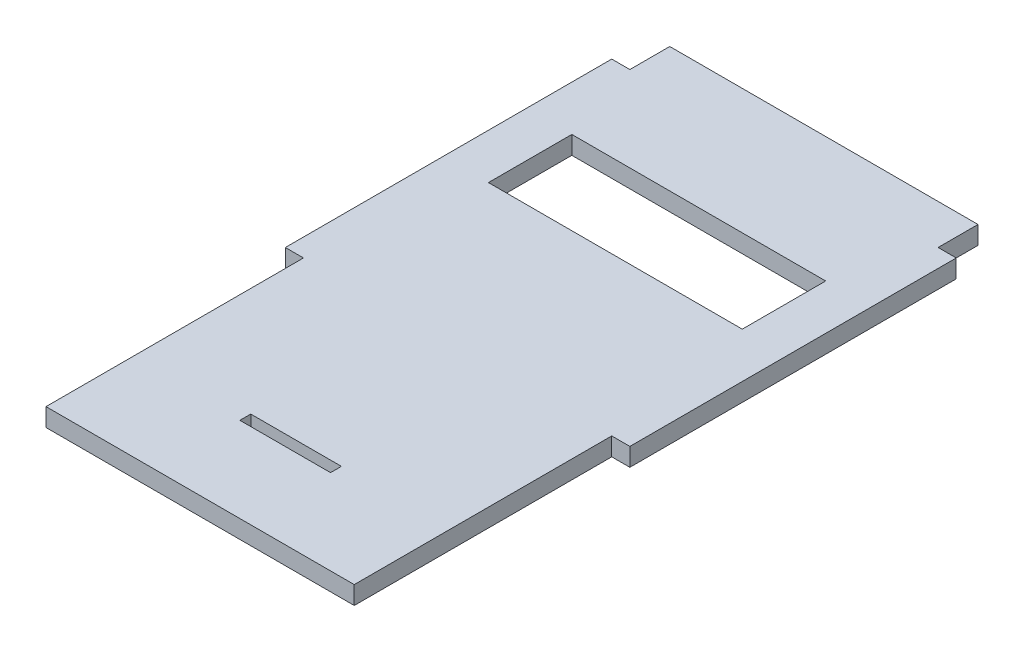
ISO-10303-21;
HEADER;
FILE_DESCRIPTION(('STEP AP214'),'2;1');
FILE_NAME('part.step','',(''),(''),'','','');
FILE_SCHEMA(('AUTOMOTIVE_DESIGN { 1 0 10303 214 1 1 1 1 }'));
ENDSEC;
DATA;
#1=APPLICATION_CONTEXT('core data for automotive mechanical design processes');
#2=APPLICATION_PROTOCOL_DEFINITION('international standard','automotive_design',2000,#1);
#3=PRODUCT_CONTEXT('',#1,'mechanical');
#4=PRODUCT('Part','Part','',(#3));
#5=PRODUCT_RELATED_PRODUCT_CATEGORY('part','',(#4));
#6=PRODUCT_DEFINITION_FORMATION('','',#4);
#7=PRODUCT_DEFINITION_CONTEXT('part definition',#1,'design');
#8=PRODUCT_DEFINITION('design','',#6,#7);
#9=PRODUCT_DEFINITION_SHAPE('','',#8);
#10=(LENGTH_UNIT() NAMED_UNIT(*) SI_UNIT(.MILLI.,.METRE.));
#11=(NAMED_UNIT(*) PLANE_ANGLE_UNIT() SI_UNIT($,.RADIAN.));
#12=(NAMED_UNIT(*) SI_UNIT($,.STERADIAN.) SOLID_ANGLE_UNIT());
#13=UNCERTAINTY_MEASURE_WITH_UNIT(LENGTH_MEASURE(1.E-05),#10,'distance_accuracy_value','');
#14=(GEOMETRIC_REPRESENTATION_CONTEXT(3) GLOBAL_UNCERTAINTY_ASSIGNED_CONTEXT((#13)) GLOBAL_UNIT_ASSIGNED_CONTEXT((#10,
#11,#12)) REPRESENTATION_CONTEXT('',''));
#15=CARTESIAN_POINT('',(0.,0.,0.));
#16=DIRECTION('',(0.,0.,1.));
#17=DIRECTION('',(1.,0.,0.));
#18=AXIS2_PLACEMENT_3D('',#15,#16,#17);
#19=CARTESIAN_POINT('',(0.,5.,0.));
#20=DIRECTION('',(0.,-1.,0.));
#21=DIRECTION('',(0.,0.,-1.));
#22=AXIS2_PLACEMENT_3D('',#19,#20,#21);
#23=PLANE('',#22);
#24=DIRECTION('',(0.,0.,-1.));
#25=VECTOR('',#24,1.);
#26=CARTESIAN_POINT('',(12.5000000000001,5.,62.5396332629801));
#27=LINE('',#26,#25);
#28=CARTESIAN_POINT('',(12.5000000000001,5.,62.5396332629801));
#29=VERTEX_POINT('',#28);
#30=CARTESIAN_POINT('',(12.5000000000001,5.,59.5396332629801));
#31=VERTEX_POINT('',#30);
#32=EDGE_CURVE('E206',#29,#31,#27,.T.);
#33=ORIENTED_EDGE('',*,*,#32,.F.);
#34=DIRECTION('',(1.,0.,0.));
#35=VECTOR('',#34,1.);
#36=CARTESIAN_POINT('',(-12.4999999999999,5.,62.5396332629801));
#37=LINE('',#36,#35);
#38=CARTESIAN_POINT('',(-12.4999999999999,5.,62.5396332629801));
#39=VERTEX_POINT('',#38);
#40=EDGE_CURVE('E214',#39,#29,#37,.T.);
#41=ORIENTED_EDGE('',*,*,#40,.F.);
#42=DIRECTION('',(0.,0.,1.));
#43=VECTOR('',#42,1.);
#44=CARTESIAN_POINT('',(-12.4999999999999,5.,62.5396332629801));
#45=LINE('',#44,#43);
#46=CARTESIAN_POINT('',(-12.4999999999999,5.,59.5396332629801));
#47=VERTEX_POINT('',#46);
#48=EDGE_CURVE('E211',#47,#39,#45,.T.);
#49=ORIENTED_EDGE('',*,*,#48,.F.);
#50=DIRECTION('',(-1.,0.,0.));
#51=VECTOR('',#50,1.);
#52=CARTESIAN_POINT('',(-12.4999999999999,5.,59.5396332629801));
#53=LINE('',#52,#51);
#54=EDGE_CURVE('E208',#31,#47,#53,.T.);
#55=ORIENTED_EDGE('',*,*,#54,.F.);
#56=EDGE_LOOP('',(#33,#41,#49,#55));
#57=FACE_BOUND('',#56,.T.);
#58=DIRECTION('',(0.,0.,-1.));
#59=VECTOR('',#58,1.);
#60=CARTESIAN_POINT('',(42.5,5.,-75.));
#61=LINE('',#60,#59);
#62=CARTESIAN_POINT('',(42.5,5.,-75.));
#63=VERTEX_POINT('',#62);
#64=CARTESIAN_POINT('',(42.5,5.,-86.));
#65=VERTEX_POINT('',#64);
#66=EDGE_CURVE('E237',#63,#65,#61,.T.);
#67=ORIENTED_EDGE('',*,*,#66,.T.);
#68=DIRECTION('',(-1.,0.,0.));
#69=VECTOR('',#68,1.);
#70=CARTESIAN_POINT('',(-42.5,5.,-86.));
#71=LINE('',#70,#69);
#72=CARTESIAN_POINT('',(-42.5,5.,-86.));
#73=VERTEX_POINT('',#72);
#74=EDGE_CURVE('E240',#65,#73,#71,.T.);
#75=ORIENTED_EDGE('',*,*,#74,.T.);
#76=DIRECTION('',(0.,0.,1.));
#77=VECTOR('',#76,1.);
#78=CARTESIAN_POINT('',(-42.5,5.,-75.));
#79=LINE('',#78,#77);
#80=CARTESIAN_POINT('',(-42.5,5.,-75.));
#81=VERTEX_POINT('',#80);
#82=EDGE_CURVE('E243',#73,#81,#79,.T.);
#83=ORIENTED_EDGE('',*,*,#82,.T.);
#84=DIRECTION('',(-1.,0.,0.));
#85=VECTOR('',#84,1.);
#86=CARTESIAN_POINT('',(-42.5,5.,-75.));
#87=LINE('',#86,#85);
#88=CARTESIAN_POINT('',(-47.5,5.,-75.));
#89=VERTEX_POINT('',#88);
#90=EDGE_CURVE('E245',#81,#89,#87,.T.);
#91=ORIENTED_EDGE('',*,*,#90,.T.);
#92=DIRECTION('',(0.,0.,1.));
#93=VECTOR('',#92,1.);
#94=CARTESIAN_POINT('',(-47.5,5.,15.));
#95=LINE('',#94,#93);
#96=CARTESIAN_POINT('',(-47.5,5.,15.));
#97=VERTEX_POINT('',#96);
#98=EDGE_CURVE('E247',#89,#97,#95,.T.);
#99=ORIENTED_EDGE('',*,*,#98,.T.);
#100=DIRECTION('',(1.,0.,0.));
#101=VECTOR('',#100,1.);
#102=CARTESIAN_POINT('',(-42.5,5.,15.));
#103=LINE('',#102,#101);
#104=CARTESIAN_POINT('',(-42.5,5.,15.));
#105=VERTEX_POINT('',#104);
#106=EDGE_CURVE('E249',#97,#105,#103,.T.);
#107=ORIENTED_EDGE('',*,*,#106,.T.);
#108=DIRECTION('',(0.,0.,1.));
#109=VECTOR('',#108,1.);
#110=CARTESIAN_POINT('',(-42.5,5.,86.));
#111=LINE('',#110,#109);
#112=CARTESIAN_POINT('',(-42.5,5.,86.));
#113=VERTEX_POINT('',#112);
#114=EDGE_CURVE('E251',#105,#113,#111,.T.);
#115=ORIENTED_EDGE('',*,*,#114,.T.);
#116=DIRECTION('',(1.,0.,0.));
#117=VECTOR('',#116,1.);
#118=CARTESIAN_POINT('',(-42.5,5.,86.));
#119=LINE('',#118,#117);
#120=CARTESIAN_POINT('',(42.5,5.,86.));
#121=VERTEX_POINT('',#120);
#122=EDGE_CURVE('E253',#113,#121,#119,.T.);
#123=ORIENTED_EDGE('',*,*,#122,.T.);
#124=DIRECTION('',(0.,0.,-1.));
#125=VECTOR('',#124,1.);
#126=CARTESIAN_POINT('',(42.5,5.,86.));
#127=LINE('',#126,#125);
#128=CARTESIAN_POINT('',(42.5,5.,15.));
#129=VERTEX_POINT('',#128);
#130=EDGE_CURVE('E255',#121,#129,#127,.T.);
#131=ORIENTED_EDGE('',*,*,#130,.T.);
#132=DIRECTION('',(1.,0.,0.));
#133=VECTOR('',#132,1.);
#134=CARTESIAN_POINT('',(42.5,5.,15.));
#135=LINE('',#134,#133);
#136=CARTESIAN_POINT('',(47.5,5.,15.));
#137=VERTEX_POINT('',#136);
#138=EDGE_CURVE('E257',#129,#137,#135,.T.);
#139=ORIENTED_EDGE('',*,*,#138,.T.);
#140=DIRECTION('',(0.,0.,-1.));
#141=VECTOR('',#140,1.);
#142=CARTESIAN_POINT('',(47.5,5.,-75.));
#143=LINE('',#142,#141);
#144=CARTESIAN_POINT('',(47.5,5.,-75.));
#145=VERTEX_POINT('',#144);
#146=EDGE_CURVE('E259',#137,#145,#143,.T.);
#147=ORIENTED_EDGE('',*,*,#146,.T.);
#148=DIRECTION('',(-1.,0.,0.));
#149=VECTOR('',#148,1.);
#150=CARTESIAN_POINT('',(42.5,5.,-75.));
#151=LINE('',#150,#149);
#152=EDGE_CURVE('E261',#145,#63,#151,.T.);
#153=ORIENTED_EDGE('',*,*,#152,.T.);
#154=EDGE_LOOP('',(#67,#75,#83,#91,#99,#107,#115,#123,#131,#139,#147,#153));
#155=FACE_BOUND('',#154,.T.);
#156=DIRECTION('',(0.,0.,-1.));
#157=VECTOR('',#156,1.);
#158=CARTESIAN_POINT('',(35.,5.,-28.5));
#159=LINE('',#158,#157);
#160=CARTESIAN_POINT('',(35.,5.,-28.5));
#161=VERTEX_POINT('',#160);
#162=CARTESIAN_POINT('',(35.,5.,-51.5));
#163=VERTEX_POINT('',#162);
#164=EDGE_CURVE('E170',#161,#163,#159,.T.);
#165=ORIENTED_EDGE('',*,*,#164,.F.);
#166=DIRECTION('',(1.,0.,0.));
#167=VECTOR('',#166,1.);
#168=CARTESIAN_POINT('',(-35.,5.,-28.5));
#169=LINE('',#168,#167);
#170=CARTESIAN_POINT('',(-35.,5.,-28.5));
#171=VERTEX_POINT('',#170);
#172=EDGE_CURVE('E192',#171,#161,#169,.T.);
#173=ORIENTED_EDGE('',*,*,#172,.F.);
#174=DIRECTION('',(0.,0.,1.));
#175=VECTOR('',#174,1.);
#176=CARTESIAN_POINT('',(-35.,5.,-28.5));
#177=LINE('',#176,#175);
#178=CARTESIAN_POINT('',(-35.,5.,-51.5));
#179=VERTEX_POINT('',#178);
#180=EDGE_CURVE('E190',#179,#171,#177,.T.);
#181=ORIENTED_EDGE('',*,*,#180,.F.);
#182=DIRECTION('',(-1.,0.,0.));
#183=VECTOR('',#182,1.);
#184=CARTESIAN_POINT('',(-35.,5.,-51.5));
#185=LINE('',#184,#183);
#186=EDGE_CURVE('E178',#163,#179,#185,.T.);
#187=ORIENTED_EDGE('',*,*,#186,.F.);
#188=EDGE_LOOP('',(#165,#173,#181,#187));
#189=FACE_BOUND('',#188,.T.);
#190=ADVANCED_FACE('F33',(#57,#155,#189),#23,.F.);
#191=CARTESIAN_POINT('',(0.,0.,0.));
#192=DIRECTION('',(0.,-1.,0.));
#193=DIRECTION('',(0.,0.,-1.));
#194=AXIS2_PLACEMENT_3D('',#191,#192,#193);
#195=PLANE('',#194);
#196=DIRECTION('',(1.,0.,0.));
#197=VECTOR('',#196,1.);
#198=CARTESIAN_POINT('',(-12.4999999999999,0.,62.5396332629801));
#199=LINE('',#198,#197);
#200=CARTESIAN_POINT('',(-12.4999999999999,0.,62.5396332629801));
#201=VERTEX_POINT('',#200);
#202=CARTESIAN_POINT('',(12.5000000000001,0.,62.5396332629801));
#203=VERTEX_POINT('',#202);
#204=EDGE_CURVE('E209',#201,#203,#199,.T.);
#205=ORIENTED_EDGE('',*,*,#204,.T.);
#206=DIRECTION('',(0.,0.,-1.));
#207=VECTOR('',#206,1.);
#208=CARTESIAN_POINT('',(12.5000000000001,0.,62.5396332629801));
#209=LINE('',#208,#207);
#210=CARTESIAN_POINT('',(12.5000000000001,0.,59.5396332629801));
#211=VERTEX_POINT('',#210);
#212=EDGE_CURVE('E186',#203,#211,#209,.T.);
#213=ORIENTED_EDGE('',*,*,#212,.T.);
#214=DIRECTION('',(-1.,0.,0.));
#215=VECTOR('',#214,1.);
#216=CARTESIAN_POINT('',(-12.4999999999999,0.,59.5396332629801));
#217=LINE('',#216,#215);
#218=CARTESIAN_POINT('',(-12.4999999999999,0.,59.5396332629801));
#219=VERTEX_POINT('',#218);
#220=EDGE_CURVE('E219',#211,#219,#217,.T.);
#221=ORIENTED_EDGE('',*,*,#220,.T.);
#222=DIRECTION('',(0.,0.,1.));
#223=VECTOR('',#222,1.);
#224=CARTESIAN_POINT('',(-12.4999999999999,0.,62.5396332629801));
#225=LINE('',#224,#223);
#226=EDGE_CURVE('E222',#219,#201,#225,.T.);
#227=ORIENTED_EDGE('',*,*,#226,.T.);
#228=EDGE_LOOP('',(#205,#213,#221,#227));
#229=FACE_BOUND('',#228,.T.);
#230=DIRECTION('',(0.,0.,-1.));
#231=VECTOR('',#230,1.);
#232=CARTESIAN_POINT('',(42.5,0.,-75.));
#233=LINE('',#232,#231);
#234=CARTESIAN_POINT('',(42.5,0.,-75.));
#235=VERTEX_POINT('',#234);
#236=CARTESIAN_POINT('',(42.5,0.,-86.));
#237=VERTEX_POINT('',#236);
#238=EDGE_CURVE('E236',#235,#237,#233,.T.);
#239=ORIENTED_EDGE('',*,*,#238,.F.);
#240=DIRECTION('',(-1.,0.,0.));
#241=VECTOR('',#240,1.);
#242=CARTESIAN_POINT('',(42.5,0.,-75.));
#243=LINE('',#242,#241);
#244=CARTESIAN_POINT('',(47.5,0.,-75.));
#245=VERTEX_POINT('',#244);
#246=EDGE_CURVE('E241',#245,#235,#243,.T.);
#247=ORIENTED_EDGE('',*,*,#246,.F.);
#248=DIRECTION('',(0.,0.,-1.));
#249=VECTOR('',#248,1.);
#250=CARTESIAN_POINT('',(47.5,0.,-75.));
#251=LINE('',#250,#249);
#252=CARTESIAN_POINT('',(47.5,0.,15.));
#253=VERTEX_POINT('',#252);
#254=EDGE_CURVE('E284',#253,#245,#251,.T.);
#255=ORIENTED_EDGE('',*,*,#254,.F.);
#256=DIRECTION('',(1.,0.,0.));
#257=VECTOR('',#256,1.);
#258=CARTESIAN_POINT('',(42.5,0.,15.));
#259=LINE('',#258,#257);
#260=CARTESIAN_POINT('',(42.5,0.,15.));
#261=VERTEX_POINT('',#260);
#262=EDGE_CURVE('E282',#261,#253,#259,.T.);
#263=ORIENTED_EDGE('',*,*,#262,.F.);
#264=DIRECTION('',(0.,0.,-1.));
#265=VECTOR('',#264,1.);
#266=CARTESIAN_POINT('',(42.5,0.,86.));
#267=LINE('',#266,#265);
#268=CARTESIAN_POINT('',(42.5,0.,86.));
#269=VERTEX_POINT('',#268);
#270=EDGE_CURVE('E280',#269,#261,#267,.T.);
#271=ORIENTED_EDGE('',*,*,#270,.F.);
#272=DIRECTION('',(1.,0.,0.));
#273=VECTOR('',#272,1.);
#274=CARTESIAN_POINT('',(-42.5,0.,86.));
#275=LINE('',#274,#273);
#276=CARTESIAN_POINT('',(-42.5,0.,86.));
#277=VERTEX_POINT('',#276);
#278=EDGE_CURVE('E278',#277,#269,#275,.T.);
#279=ORIENTED_EDGE('',*,*,#278,.F.);
#280=DIRECTION('',(0.,0.,1.));
#281=VECTOR('',#280,1.);
#282=CARTESIAN_POINT('',(-42.5,0.,86.));
#283=LINE('',#282,#281);
#284=CARTESIAN_POINT('',(-42.5,0.,15.));
#285=VERTEX_POINT('',#284);
#286=EDGE_CURVE('E276',#285,#277,#283,.T.);
#287=ORIENTED_EDGE('',*,*,#286,.F.);
#288=DIRECTION('',(1.,0.,0.));
#289=VECTOR('',#288,1.);
#290=CARTESIAN_POINT('',(-42.5,0.,15.));
#291=LINE('',#290,#289);
#292=CARTESIAN_POINT('',(-47.5,0.,15.));
#293=VERTEX_POINT('',#292);
#294=EDGE_CURVE('E274',#293,#285,#291,.T.);
#295=ORIENTED_EDGE('',*,*,#294,.F.);
#296=DIRECTION('',(0.,0.,1.));
#297=VECTOR('',#296,1.);
#298=CARTESIAN_POINT('',(-47.5,0.,15.));
#299=LINE('',#298,#297);
#300=CARTESIAN_POINT('',(-47.5,0.,-75.));
#301=VERTEX_POINT('',#300);
#302=EDGE_CURVE('E272',#301,#293,#299,.T.);
#303=ORIENTED_EDGE('',*,*,#302,.F.);
#304=DIRECTION('',(-1.,0.,0.));
#305=VECTOR('',#304,1.);
#306=CARTESIAN_POINT('',(-42.5,0.,-75.));
#307=LINE('',#306,#305);
#308=CARTESIAN_POINT('',(-42.5,0.,-75.));
#309=VERTEX_POINT('',#308);
#310=EDGE_CURVE('E270',#309,#301,#307,.T.);
#311=ORIENTED_EDGE('',*,*,#310,.F.);
#312=DIRECTION('',(0.,0.,1.));
#313=VECTOR('',#312,1.);
#314=CARTESIAN_POINT('',(-42.5,0.,-75.));
#315=LINE('',#314,#313);
#316=CARTESIAN_POINT('',(-42.5,0.,-86.));
#317=VERTEX_POINT('',#316);
#318=EDGE_CURVE('E268',#317,#309,#315,.T.);
#319=ORIENTED_EDGE('',*,*,#318,.F.);
#320=DIRECTION('',(-1.,0.,0.));
#321=VECTOR('',#320,1.);
#322=CARTESIAN_POINT('',(-42.5,0.,-86.));
#323=LINE('',#322,#321);
#324=EDGE_CURVE('E266',#237,#317,#323,.T.);
#325=ORIENTED_EDGE('',*,*,#324,.F.);
#326=EDGE_LOOP('',(#239,#247,#255,#263,#271,#279,#287,#295,#303,#311,#319,#325));
#327=FACE_BOUND('',#326,.T.);
#328=DIRECTION('',(1.,0.,0.));
#329=VECTOR('',#328,1.);
#330=CARTESIAN_POINT('',(-35.,0.,-28.5));
#331=LINE('',#330,#329);
#332=CARTESIAN_POINT('',(-35.,0.,-28.5));
#333=VERTEX_POINT('',#332);
#334=CARTESIAN_POINT('',(35.,0.,-28.5));
#335=VERTEX_POINT('',#334);
#336=EDGE_CURVE('E179',#333,#335,#331,.T.);
#337=ORIENTED_EDGE('',*,*,#336,.T.);
#338=DIRECTION('',(0.,0.,-1.));
#339=VECTOR('',#338,1.);
#340=CARTESIAN_POINT('',(35.,0.,-28.5));
#341=LINE('',#340,#339);
#342=CARTESIAN_POINT('',(35.,0.,-51.5));
#343=VERTEX_POINT('',#342);
#344=EDGE_CURVE('E56',#335,#343,#341,.T.);
#345=ORIENTED_EDGE('',*,*,#344,.T.);
#346=DIRECTION('',(-1.,0.,0.));
#347=VECTOR('',#346,1.);
#348=CARTESIAN_POINT('',(-35.,0.,-51.5));
#349=LINE('',#348,#347);
#350=CARTESIAN_POINT('',(-35.,0.,-51.5));
#351=VERTEX_POINT('',#350);
#352=EDGE_CURVE('E185',#343,#351,#349,.T.);
#353=ORIENTED_EDGE('',*,*,#352,.T.);
#354=DIRECTION('',(0.,0.,1.));
#355=VECTOR('',#354,1.);
#356=CARTESIAN_POINT('',(-35.,0.,-28.5));
#357=LINE('',#356,#355);
#358=EDGE_CURVE('E198',#351,#333,#357,.T.);
#359=ORIENTED_EDGE('',*,*,#358,.T.);
#360=EDGE_LOOP('',(#337,#345,#353,#359));
#361=FACE_BOUND('',#360,.T.);
#362=ADVANCED_FACE('F326',(#229,#327,#361),#195,.T.);
#363=CARTESIAN_POINT('',(42.5,5.,-75.));
#364=DIRECTION('',(-1.,0.,0.));
#365=DIRECTION('',(0.,0.,1.));
#366=AXIS2_PLACEMENT_3D('',#363,#364,#365);
#367=PLANE('',#366);
#368=ORIENTED_EDGE('',*,*,#238,.T.);
#369=DIRECTION('',(0.,-1.,0.));
#370=VECTOR('',#369,1.);
#371=CARTESIAN_POINT('',(42.5,5.,-86.));
#372=LINE('',#371,#370);
#373=EDGE_CURVE('E11',#65,#237,#372,.T.);
#374=ORIENTED_EDGE('',*,*,#373,.F.);
#375=ORIENTED_EDGE('',*,*,#66,.F.);
#376=DIRECTION('',(0.,-1.,0.));
#377=VECTOR('',#376,1.);
#378=CARTESIAN_POINT('',(42.5,5.,-75.));
#379=LINE('',#378,#377);
#380=EDGE_CURVE('E263',#63,#235,#379,.T.);
#381=ORIENTED_EDGE('',*,*,#380,.T.);
#382=EDGE_LOOP('',(#368,#374,#375,#381));
#383=FACE_BOUND('',#382,.T.);
#384=ADVANCED_FACE('F35',(#383),#367,.F.);
#385=CARTESIAN_POINT('',(-42.5,5.,-86.));
#386=DIRECTION('',(0.,0.,1.));
#387=DIRECTION('',(1.,0.,0.));
#388=AXIS2_PLACEMENT_3D('',#385,#386,#387);
#389=PLANE('',#388);
#390=ORIENTED_EDGE('',*,*,#324,.T.);
#391=DIRECTION('',(0.,-1.,0.));
#392=VECTOR('',#391,1.);
#393=CARTESIAN_POINT('',(-42.5,5.,-86.));
#394=LINE('',#393,#392);
#395=EDGE_CURVE('E41',#73,#317,#394,.T.);
#396=ORIENTED_EDGE('',*,*,#395,.F.);
#397=ORIENTED_EDGE('',*,*,#74,.F.);
#398=ORIENTED_EDGE('',*,*,#373,.T.);
#399=EDGE_LOOP('',(#390,#396,#397,#398));
#400=FACE_BOUND('',#399,.T.);
#401=ADVANCED_FACE('F343',(#400),#389,.F.);
#402=CARTESIAN_POINT('',(-42.5,5.,-75.));
#403=DIRECTION('',(1.,0.,0.));
#404=DIRECTION('',(0.,0.,-1.));
#405=AXIS2_PLACEMENT_3D('',#402,#403,#404);
#406=PLANE('',#405);
#407=ORIENTED_EDGE('',*,*,#318,.T.);
#408=DIRECTION('',(0.,-1.,0.));
#409=VECTOR('',#408,1.);
#410=CARTESIAN_POINT('',(-42.5,5.,-75.));
#411=LINE('',#410,#409);
#412=EDGE_CURVE('E313',#81,#309,#411,.T.);
#413=ORIENTED_EDGE('',*,*,#412,.F.);
#414=ORIENTED_EDGE('',*,*,#82,.F.);
#415=ORIENTED_EDGE('',*,*,#395,.T.);
#416=EDGE_LOOP('',(#407,#413,#414,#415));
#417=FACE_BOUND('',#416,.T.);
#418=ADVANCED_FACE('F320',(#417),#406,.F.);
#419=CARTESIAN_POINT('',(-42.5,5.,-75.));
#420=DIRECTION('',(0.,0.,1.));
#421=DIRECTION('',(1.,0.,0.));
#422=AXIS2_PLACEMENT_3D('',#419,#420,#421);
#423=PLANE('',#422);
#424=ORIENTED_EDGE('',*,*,#310,.T.);
#425=DIRECTION('',(0.,-1.,0.));
#426=VECTOR('',#425,1.);
#427=CARTESIAN_POINT('',(-47.5,5.,-75.));
#428=LINE('',#427,#426);
#429=EDGE_CURVE('E310',#89,#301,#428,.T.);
#430=ORIENTED_EDGE('',*,*,#429,.F.);
#431=ORIENTED_EDGE('',*,*,#90,.F.);
#432=ORIENTED_EDGE('',*,*,#412,.T.);
#433=EDGE_LOOP('',(#424,#430,#431,#432));
#434=FACE_BOUND('',#433,.T.);
#435=ADVANCED_FACE('F332',(#434),#423,.F.);
#436=CARTESIAN_POINT('',(-47.5,5.,15.));
#437=DIRECTION('',(1.,0.,0.));
#438=DIRECTION('',(0.,0.,-1.));
#439=AXIS2_PLACEMENT_3D('',#436,#437,#438);
#440=PLANE('',#439);
#441=ORIENTED_EDGE('',*,*,#302,.T.);
#442=DIRECTION('',(0.,-1.,0.));
#443=VECTOR('',#442,1.);
#444=CARTESIAN_POINT('',(-47.5,5.,15.));
#445=LINE('',#444,#443);
#446=EDGE_CURVE('E307',#97,#293,#445,.T.);
#447=ORIENTED_EDGE('',*,*,#446,.F.);
#448=ORIENTED_EDGE('',*,*,#98,.F.);
#449=ORIENTED_EDGE('',*,*,#429,.T.);
#450=EDGE_LOOP('',(#441,#447,#448,#449));
#451=FACE_BOUND('',#450,.T.);
#452=ADVANCED_FACE('F336',(#451),#440,.F.);
#453=CARTESIAN_POINT('',(-42.5,5.,15.));
#454=DIRECTION('',(0.,0.,-1.));
#455=DIRECTION('',(-1.,0.,0.));
#456=AXIS2_PLACEMENT_3D('',#453,#454,#455);
#457=PLANE('',#456);
#458=ORIENTED_EDGE('',*,*,#294,.T.);
#459=DIRECTION('',(0.,-1.,0.));
#460=VECTOR('',#459,1.);
#461=CARTESIAN_POINT('',(-42.5,5.,15.));
#462=LINE('',#461,#460);
#463=EDGE_CURVE('E304',#105,#285,#462,.T.);
#464=ORIENTED_EDGE('',*,*,#463,.F.);
#465=ORIENTED_EDGE('',*,*,#106,.F.);
#466=ORIENTED_EDGE('',*,*,#446,.T.);
#467=EDGE_LOOP('',(#458,#464,#465,#466));
#468=FACE_BOUND('',#467,.T.);
#469=ADVANCED_FACE('F376',(#468),#457,.F.);
#470=CARTESIAN_POINT('',(-42.5,5.,86.));
#471=DIRECTION('',(1.,0.,0.));
#472=DIRECTION('',(0.,0.,-1.));
#473=AXIS2_PLACEMENT_3D('',#470,#471,#472);
#474=PLANE('',#473);
#475=ORIENTED_EDGE('',*,*,#286,.T.);
#476=DIRECTION('',(0.,-1.,0.));
#477=VECTOR('',#476,1.);
#478=CARTESIAN_POINT('',(-42.5,5.,86.));
#479=LINE('',#478,#477);
#480=EDGE_CURVE('E301',#113,#277,#479,.T.);
#481=ORIENTED_EDGE('',*,*,#480,.F.);
#482=ORIENTED_EDGE('',*,*,#114,.F.);
#483=ORIENTED_EDGE('',*,*,#463,.T.);
#484=EDGE_LOOP('',(#475,#481,#482,#483));
#485=FACE_BOUND('',#484,.T.);
#486=ADVANCED_FACE('F374',(#485),#474,.F.);
#487=CARTESIAN_POINT('',(-42.5,5.,86.));
#488=DIRECTION('',(0.,0.,-1.));
#489=DIRECTION('',(-1.,0.,0.));
#490=AXIS2_PLACEMENT_3D('',#487,#488,#489);
#491=PLANE('',#490);
#492=ORIENTED_EDGE('',*,*,#278,.T.);
#493=DIRECTION('',(0.,-1.,0.));
#494=VECTOR('',#493,1.);
#495=CARTESIAN_POINT('',(42.5,5.,86.));
#496=LINE('',#495,#494);
#497=EDGE_CURVE('E298',#121,#269,#496,.T.);
#498=ORIENTED_EDGE('',*,*,#497,.F.);
#499=ORIENTED_EDGE('',*,*,#122,.F.);
#500=ORIENTED_EDGE('',*,*,#480,.T.);
#501=EDGE_LOOP('',(#492,#498,#499,#500));
#502=FACE_BOUND('',#501,.T.);
#503=ADVANCED_FACE('F370',(#502),#491,.F.);
#504=CARTESIAN_POINT('',(42.5,5.,86.));
#505=DIRECTION('',(-1.,0.,0.));
#506=DIRECTION('',(0.,0.,1.));
#507=AXIS2_PLACEMENT_3D('',#504,#505,#506);
#508=PLANE('',#507);
#509=ORIENTED_EDGE('',*,*,#270,.T.);
#510=DIRECTION('',(0.,-1.,0.));
#511=VECTOR('',#510,1.);
#512=CARTESIAN_POINT('',(42.5,5.,15.));
#513=LINE('',#512,#511);
#514=EDGE_CURVE('E295',#129,#261,#513,.T.);
#515=ORIENTED_EDGE('',*,*,#514,.F.);
#516=ORIENTED_EDGE('',*,*,#130,.F.);
#517=ORIENTED_EDGE('',*,*,#497,.T.);
#518=EDGE_LOOP('',(#509,#515,#516,#517));
#519=FACE_BOUND('',#518,.T.);
#520=ADVANCED_FACE('F365',(#519),#508,.F.);
#521=CARTESIAN_POINT('',(42.5,5.,15.));
#522=DIRECTION('',(0.,0.,-1.));
#523=DIRECTION('',(-1.,0.,0.));
#524=AXIS2_PLACEMENT_3D('',#521,#522,#523);
#525=PLANE('',#524);
#526=ORIENTED_EDGE('',*,*,#262,.T.);
#527=DIRECTION('',(0.,-1.,0.));
#528=VECTOR('',#527,1.);
#529=CARTESIAN_POINT('',(47.5,5.,15.));
#530=LINE('',#529,#528);
#531=EDGE_CURVE('E292',#137,#253,#530,.T.);
#532=ORIENTED_EDGE('',*,*,#531,.F.);
#533=ORIENTED_EDGE('',*,*,#138,.F.);
#534=ORIENTED_EDGE('',*,*,#514,.T.);
#535=EDGE_LOOP('',(#526,#532,#533,#534));
#536=FACE_BOUND('',#535,.T.);
#537=ADVANCED_FACE('F359',(#536),#525,.F.);
#538=CARTESIAN_POINT('',(47.5,5.,-75.));
#539=DIRECTION('',(-1.,0.,0.));
#540=DIRECTION('',(0.,0.,1.));
#541=AXIS2_PLACEMENT_3D('',#538,#539,#540);
#542=PLANE('',#541);
#543=ORIENTED_EDGE('',*,*,#254,.T.);
#544=DIRECTION('',(0.,-1.,0.));
#545=VECTOR('',#544,1.);
#546=CARTESIAN_POINT('',(47.5,5.,-75.));
#547=LINE('',#546,#545);
#548=EDGE_CURVE('E289',#145,#245,#547,.T.);
#549=ORIENTED_EDGE('',*,*,#548,.F.);
#550=ORIENTED_EDGE('',*,*,#146,.F.);
#551=ORIENTED_EDGE('',*,*,#531,.T.);
#552=EDGE_LOOP('',(#543,#549,#550,#551));
#553=FACE_BOUND('',#552,.T.);
#554=ADVANCED_FACE('F355',(#553),#542,.F.);
#555=CARTESIAN_POINT('',(42.5,5.,-75.));
#556=DIRECTION('',(0.,0.,1.));
#557=DIRECTION('',(1.,0.,0.));
#558=AXIS2_PLACEMENT_3D('',#555,#556,#557);
#559=PLANE('',#558);
#560=ORIENTED_EDGE('',*,*,#246,.T.);
#561=ORIENTED_EDGE('',*,*,#380,.F.);
#562=ORIENTED_EDGE('',*,*,#152,.F.);
#563=ORIENTED_EDGE('',*,*,#548,.T.);
#564=EDGE_LOOP('',(#560,#561,#562,#563));
#565=FACE_BOUND('',#564,.T.);
#566=ADVANCED_FACE('F350',(#565),#559,.F.);
#567=CARTESIAN_POINT('',(12.5000000000001,5.,62.5396332629801));
#568=DIRECTION('',(-1.,0.,0.));
#569=DIRECTION('',(0.,0.,1.));
#570=AXIS2_PLACEMENT_3D('',#567,#568,#569);
#571=PLANE('',#570);
#572=ORIENTED_EDGE('',*,*,#212,.F.);
#573=DIRECTION('',(0.,-1.,0.));
#574=VECTOR('',#573,1.);
#575=CARTESIAN_POINT('',(12.5000000000001,5.,62.5396332629801));
#576=LINE('',#575,#574);
#577=EDGE_CURVE('E216',#29,#203,#576,.T.);
#578=ORIENTED_EDGE('',*,*,#577,.F.);
#579=ORIENTED_EDGE('',*,*,#32,.T.);
#580=DIRECTION('',(0.,-1.,0.));
#581=VECTOR('',#580,1.);
#582=CARTESIAN_POINT('',(12.5000000000001,5.,59.5396332629801));
#583=LINE('',#582,#581);
#584=EDGE_CURVE('E233',#31,#211,#583,.T.);
#585=ORIENTED_EDGE('',*,*,#584,.T.);
#586=EDGE_LOOP('',(#572,#578,#579,#585));
#587=FACE_BOUND('',#586,.T.);
#588=ADVANCED_FACE('F395',(#587),#571,.T.);
#589=CARTESIAN_POINT('',(-12.4999999999999,5.,59.5396332629801));
#590=DIRECTION('',(0.,0.,1.));
#591=DIRECTION('',(1.,0.,0.));
#592=AXIS2_PLACEMENT_3D('',#589,#590,#591);
#593=PLANE('',#592);
#594=ORIENTED_EDGE('',*,*,#220,.F.);
#595=ORIENTED_EDGE('',*,*,#584,.F.);
#596=ORIENTED_EDGE('',*,*,#54,.T.);
#597=DIRECTION('',(0.,-1.,0.));
#598=VECTOR('',#597,1.);
#599=CARTESIAN_POINT('',(-12.4999999999999,5.,59.5396332629801));
#600=LINE('',#599,#598);
#601=EDGE_CURVE('E231',#47,#219,#600,.T.);
#602=ORIENTED_EDGE('',*,*,#601,.T.);
#603=EDGE_LOOP('',(#594,#595,#596,#602));
#604=FACE_BOUND('',#603,.T.);
#605=ADVANCED_FACE('F433',(#604),#593,.T.);
#606=CARTESIAN_POINT('',(-12.4999999999999,5.,62.5396332629801));
#607=DIRECTION('',(1.,0.,0.));
#608=DIRECTION('',(0.,0.,-1.));
#609=AXIS2_PLACEMENT_3D('',#606,#607,#608);
#610=PLANE('',#609);
#611=ORIENTED_EDGE('',*,*,#226,.F.);
#612=ORIENTED_EDGE('',*,*,#601,.F.);
#613=ORIENTED_EDGE('',*,*,#48,.T.);
#614=DIRECTION('',(0.,-1.,0.));
#615=VECTOR('',#614,1.);
#616=CARTESIAN_POINT('',(-12.4999999999999,5.,62.5396332629801));
#617=LINE('',#616,#615);
#618=EDGE_CURVE('E229',#39,#201,#617,.T.);
#619=ORIENTED_EDGE('',*,*,#618,.T.);
#620=EDGE_LOOP('',(#611,#612,#613,#619));
#621=FACE_BOUND('',#620,.T.);
#622=ADVANCED_FACE('F440',(#621),#610,.T.);
#623=CARTESIAN_POINT('',(-12.4999999999999,5.,62.5396332629801));
#624=DIRECTION('',(0.,0.,-1.));
#625=DIRECTION('',(-1.,0.,0.));
#626=AXIS2_PLACEMENT_3D('',#623,#624,#625);
#627=PLANE('',#626);
#628=ORIENTED_EDGE('',*,*,#204,.F.);
#629=ORIENTED_EDGE('',*,*,#618,.F.);
#630=ORIENTED_EDGE('',*,*,#40,.T.);
#631=ORIENTED_EDGE('',*,*,#577,.T.);
#632=EDGE_LOOP('',(#628,#629,#630,#631));
#633=FACE_BOUND('',#632,.T.);
#634=ADVANCED_FACE('F447',(#633),#627,.T.);
#635=CARTESIAN_POINT('',(35.,5.,-28.5));
#636=DIRECTION('',(-1.,0.,0.));
#637=DIRECTION('',(0.,0.,1.));
#638=AXIS2_PLACEMENT_3D('',#635,#636,#637);
#639=PLANE('',#638);
#640=ORIENTED_EDGE('',*,*,#344,.F.);
#641=DIRECTION('',(0.,-1.,0.));
#642=VECTOR('',#641,1.);
#643=CARTESIAN_POINT('',(35.,5.,-28.5));
#644=LINE('',#643,#642);
#645=EDGE_CURVE('E174',#161,#335,#644,.T.);
#646=ORIENTED_EDGE('',*,*,#645,.F.);
#647=ORIENTED_EDGE('',*,*,#164,.T.);
#648=DIRECTION('',(0.,-1.,0.));
#649=VECTOR('',#648,1.);
#650=CARTESIAN_POINT('',(35.,5.,-51.5));
#651=LINE('',#650,#649);
#652=EDGE_CURVE('E173',#163,#343,#651,.T.);
#653=ORIENTED_EDGE('',*,*,#652,.T.);
#654=EDGE_LOOP('',(#640,#646,#647,#653));
#655=FACE_BOUND('',#654,.T.);
#656=ADVANCED_FACE('F172',(#655),#639,.T.);
#657=CARTESIAN_POINT('',(-35.,5.,-51.5));
#658=DIRECTION('',(0.,0.,1.));
#659=DIRECTION('',(1.,0.,0.));
#660=AXIS2_PLACEMENT_3D('',#657,#658,#659);
#661=PLANE('',#660);
#662=ORIENTED_EDGE('',*,*,#352,.F.);
#663=ORIENTED_EDGE('',*,*,#652,.F.);
#664=ORIENTED_EDGE('',*,*,#186,.T.);
#665=DIRECTION('',(0.,-1.,0.));
#666=VECTOR('',#665,1.);
#667=CARTESIAN_POINT('',(-35.,5.,-51.5));
#668=LINE('',#667,#666);
#669=EDGE_CURVE('E187',#179,#351,#668,.T.);
#670=ORIENTED_EDGE('',*,*,#669,.T.);
#671=EDGE_LOOP('',(#662,#663,#664,#670));
#672=FACE_BOUND('',#671,.T.);
#673=ADVANCED_FACE('F182',(#672),#661,.T.);
#674=CARTESIAN_POINT('',(-35.,5.,-28.5));
#675=DIRECTION('',(1.,0.,0.));
#676=DIRECTION('',(0.,0.,-1.));
#677=AXIS2_PLACEMENT_3D('',#674,#675,#676);
#678=PLANE('',#677);
#679=ORIENTED_EDGE('',*,*,#358,.F.);
#680=ORIENTED_EDGE('',*,*,#669,.F.);
#681=ORIENTED_EDGE('',*,*,#180,.T.);
#682=DIRECTION('',(0.,-1.,0.));
#683=VECTOR('',#682,1.);
#684=CARTESIAN_POINT('',(-35.,5.,-28.5));
#685=LINE('',#684,#683);
#686=EDGE_CURVE('E48',#171,#333,#685,.T.);
#687=ORIENTED_EDGE('',*,*,#686,.T.);
#688=EDGE_LOOP('',(#679,#680,#681,#687));
#689=FACE_BOUND('',#688,.T.);
#690=ADVANCED_FACE('F468',(#689),#678,.T.);
#691=CARTESIAN_POINT('',(-35.,5.,-28.5));
#692=DIRECTION('',(0.,0.,-1.));
#693=DIRECTION('',(-1.,0.,0.));
#694=AXIS2_PLACEMENT_3D('',#691,#692,#693);
#695=PLANE('',#694);
#696=ORIENTED_EDGE('',*,*,#336,.F.);
#697=ORIENTED_EDGE('',*,*,#686,.F.);
#698=ORIENTED_EDGE('',*,*,#172,.T.);
#699=ORIENTED_EDGE('',*,*,#645,.T.);
#700=EDGE_LOOP('',(#696,#697,#698,#699));
#701=FACE_BOUND('',#700,.T.);
#702=ADVANCED_FACE('F475',(#701),#695,.T.);
#703=CLOSED_SHELL('',(#190,#362,#384,#401,#418,#435,#452,#469,#486,#503,#520,#537,#554,#566,
#588,#605,#622,#634,#656,#673,#690,#702));
#704=MANIFOLD_SOLID_BREP('B2',#703);
#705=ADVANCED_BREP_SHAPE_REPRESENTATION('',(#18,#704),#14);
#706=SHAPE_DEFINITION_REPRESENTATION(#9,#705);
ENDSEC;
END-ISO-10303-21;
